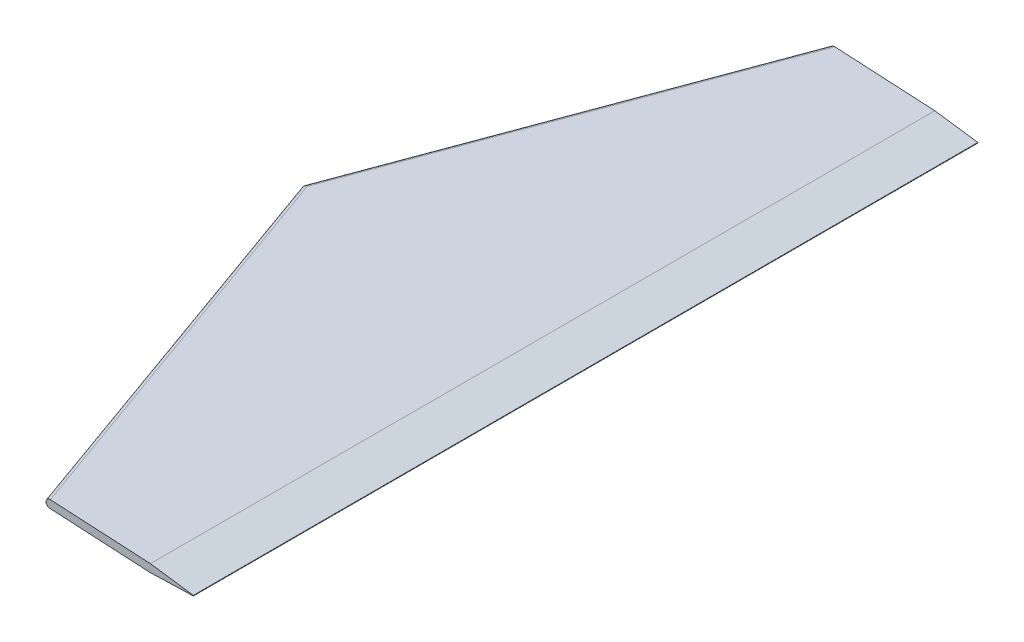
ISO-10303-21;
HEADER;
FILE_DESCRIPTION(('STEP AP214'),'2;1');
FILE_NAME('part.step','',(''),(''),'','','');
FILE_SCHEMA(('AUTOMOTIVE_DESIGN { 1 0 10303 214 1 1 1 1 }'));
ENDSEC;
DATA;
#1=APPLICATION_CONTEXT('core data for automotive mechanical design processes');
#2=APPLICATION_PROTOCOL_DEFINITION('international standard','automotive_design',2000,#1);
#3=PRODUCT_CONTEXT('',#1,'mechanical');
#4=PRODUCT('Part','Part','',(#3));
#5=PRODUCT_RELATED_PRODUCT_CATEGORY('part','',(#4));
#6=PRODUCT_DEFINITION_FORMATION('','',#4);
#7=PRODUCT_DEFINITION_CONTEXT('part definition',#1,'design');
#8=PRODUCT_DEFINITION('design','',#6,#7);
#9=PRODUCT_DEFINITION_SHAPE('','',#8);
#10=(LENGTH_UNIT() NAMED_UNIT(*) SI_UNIT(.MILLI.,.METRE.));
#11=(NAMED_UNIT(*) PLANE_ANGLE_UNIT() SI_UNIT($,.RADIAN.));
#12=(NAMED_UNIT(*) SI_UNIT($,.STERADIAN.) SOLID_ANGLE_UNIT());
#13=UNCERTAINTY_MEASURE_WITH_UNIT(LENGTH_MEASURE(1.E-05),#10,'distance_accuracy_value','');
#14=(GEOMETRIC_REPRESENTATION_CONTEXT(3) GLOBAL_UNCERTAINTY_ASSIGNED_CONTEXT((#13)) GLOBAL_UNIT_ASSIGNED_CONTEXT((#10,
#11,#12)) REPRESENTATION_CONTEXT('',''));
#15=CARTESIAN_POINT('',(0.,0.,0.));
#16=DIRECTION('',(0.,0.,1.));
#17=DIRECTION('',(1.,0.,0.));
#18=AXIS2_PLACEMENT_3D('',#15,#16,#17);
#19=CARTESIAN_POINT('',(0.,0.,275.6));
#20=DIRECTION('',(0.0539045346360019,0.998546093651002,0.));
#21=DIRECTION('',(-0.998546093651002,0.0539045346360019,0.));
#22=AXIS2_PLACEMENT_3D('',#19,#20,#21);
#23=PLANE('',#22);
#24=DIRECTION('',(-0.326634975757512,0.0176327427206422,-0.944986073440258));
#25=VECTOR('',#24,1.);
#26=CARTESIAN_POINT('',(87.6631460975016,-4.73232144731141,245.210881880629));
#27=LINE('',#26,#25);
#28=CARTESIAN_POINT('',(98.1671621239773,-5.29935996392712,275.6));
#29=VERTEX_POINT('',#28);
#30=CARTESIAN_POINT('',(2.90586478967181,-0.156867359652552,0.));
#31=VERTEX_POINT('',#30);
#32=EDGE_CURVE('E156',#29,#31,#27,.T.);
#33=ORIENTED_EDGE('',*,*,#32,.T.);
#34=DIRECTION('',(0.326634975757512,-0.0176327427206422,-0.944986073440258));
#35=VECTOR('',#34,1.);
#36=CARTESIAN_POINT('',(-82.4732792604655,4.45215675741676,247.009989981987));
#37=LINE('',#36,#35);
#38=CARTESIAN_POINT('',(98.1671621239773,-5.29935996392712,-275.6));
#39=VERTEX_POINT('',#38);
#40=EDGE_CURVE('E127',#31,#39,#37,.T.);
#41=ORIENTED_EDGE('',*,*,#40,.T.);
#42=DIRECTION('',(0.998546093651002,-0.0539045346360019,0.));
#43=VECTOR('',#42,1.);
#44=CARTESIAN_POINT('',(0.,0.,-275.6));
#45=LINE('',#44,#43);
#46=CARTESIAN_POINT('',(168.454725998924,-9.09369499309351,-275.6));
#47=VERTEX_POINT('',#46);
#48=EDGE_CURVE('E113',#39,#47,#45,.T.);
#49=ORIENTED_EDGE('',*,*,#48,.T.);
#50=DIRECTION('',(0.,0.,1.));
#51=VECTOR('',#50,1.);
#52=CARTESIAN_POINT('',(168.454725998924,-9.09369499309351,-275.6));
#53=LINE('',#52,#51);
#54=CARTESIAN_POINT('',(168.454725998924,-9.09369499309351,275.6));
#55=VERTEX_POINT('',#54);
#56=EDGE_CURVE('E119',#47,#55,#53,.T.);
#57=ORIENTED_EDGE('',*,*,#56,.T.);
#58=DIRECTION('',(0.998546093651002,-0.0539045346360019,0.));
#59=VECTOR('',#58,1.);
#60=CARTESIAN_POINT('',(0.,0.,275.6));
#61=LINE('',#60,#59);
#62=EDGE_CURVE('E150',#29,#55,#61,.T.);
#63=ORIENTED_EDGE('',*,*,#62,.F.);
#64=EDGE_LOOP('',(#33,#41,#49,#57,#63));
#65=FACE_BOUND('',#64,.T.);
#66=ADVANCED_FACE('F33',(#65),#23,.F.);
#67=CARTESIAN_POINT('',(0.296906614910487,5.5,275.6));
#68=DIRECTION('',(0.0539045346360018,0.998546093651002,0.));
#69=DIRECTION('',(-0.998546093651002,0.0539045346360019,0.));
#70=AXIS2_PLACEMENT_3D('',#67,#68,#69);
#71=PLANE('',#70);
#72=DIRECTION('',(0.998546093651002,-0.0539045346360018,0.));
#73=VECTOR('',#72,1.);
#74=CARTESIAN_POINT('',(0.296906614910487,5.5,-275.6));
#75=LINE('',#74,#73);
#76=CARTESIAN_POINT('',(98.4640687388878,0.200640036072879,-275.6));
#77=VERTEX_POINT('',#76);
#78=CARTESIAN_POINT('',(168.751632613834,-3.59369499309351,-275.6));
#79=VERTEX_POINT('',#78);
#80=EDGE_CURVE('E129',#77,#79,#75,.T.);
#81=ORIENTED_EDGE('',*,*,#80,.F.);
#82=DIRECTION('',(0.326634975757512,-0.0176327427206422,-0.944986073440258));
#83=VECTOR('',#82,1.);
#84=CARTESIAN_POINT('',(2.8918400334285,5.35991765505268,0.899554050678706));
#85=LINE('',#84,#83);
#86=CARTESIAN_POINT('',(3.20277140458229,5.34313264034745,0.));
#87=VERTEX_POINT('',#86);
#88=EDGE_CURVE('E170',#77,#87,#85,.F.);
#89=ORIENTED_EDGE('',*,*,#88,.T.);
#90=DIRECTION('',(-0.326634975757512,0.0176327427206422,-0.944986073440258));
#91=VECTOR('',#90,1.);
#92=CARTESIAN_POINT('',(98.153137367734,0.217425050778108,274.700445949321));
#93=LINE('',#92,#91);
#94=CARTESIAN_POINT('',(98.4640687388878,0.20064003607288,275.6));
#95=VERTEX_POINT('',#94);
#96=EDGE_CURVE('E168',#87,#95,#93,.F.);
#97=ORIENTED_EDGE('',*,*,#96,.T.);
#98=DIRECTION('',(0.998546093651002,-0.0539045346360018,0.));
#99=VECTOR('',#98,1.);
#100=CARTESIAN_POINT('',(0.296906614910487,5.5,275.6));
#101=LINE('',#100,#99);
#102=CARTESIAN_POINT('',(168.751632613834,-3.59369499309351,275.6));
#103=VERTEX_POINT('',#102);
#104=EDGE_CURVE('E128',#95,#103,#101,.T.);
#105=ORIENTED_EDGE('',*,*,#104,.T.);
#106=DIRECTION('',(0.,0.,1.));
#107=VECTOR('',#106,1.);
#108=CARTESIAN_POINT('',(168.751632613834,-3.59369499309351,-275.6));
#109=LINE('',#108,#107);
#110=EDGE_CURVE('E139',#79,#103,#109,.T.);
#111=ORIENTED_EDGE('',*,*,#110,.F.);
#112=EDGE_LOOP('',(#81,#89,#97,#105,#111));
#113=FACE_BOUND('',#112,.T.);
#114=ADVANCED_FACE('F212',(#113),#71,.T.);
#115=CARTESIAN_POINT('',(0.,0.,275.6));
#116=DIRECTION('',(0.,0.,-1.));
#117=DIRECTION('',(-1.,0.,0.));
#118=AXIS2_PLACEMENT_3D('',#115,#116,#117);
#119=PLANE('',#118);
#120=DIRECTION('',(-0.999547289474812,-0.0300868094612245,0.));
#121=VECTOR('',#120,1.);
#122=CARTESIAN_POINT('',(201.255636568767,-8.10637327569077,275.6));
#123=LINE('',#122,#121);
#124=CARTESIAN_POINT('',(198.881987466853,-8.17782114915217,275.6));
#125=VERTEX_POINT('',#124);
#126=EDGE_CURVE('E120',#125,#55,#123,.T.);
#127=ORIENTED_EDGE('',*,*,#126,.F.);
#128=CARTESIAN_POINT('',(198.875970104961,-7.9779116912572,275.6));
#129=DIRECTION('',(0.,0.,-1.));
#130=DIRECTION('',(-1.,0.,0.));
#131=AXIS2_PLACEMENT_3D('',#128,#129,#130);
#132=CIRCLE('',#131,0.2);
#133=CARTESIAN_POINT('',(198.903473215499,-7.77981176972574,275.6));
#134=VERTEX_POINT('',#133);
#135=EDGE_CURVE('E55',#125,#134,#132,.F.);
#136=ORIENTED_EDGE('',*,*,#135,.T.);
#137=DIRECTION('',(0.990499607657291,-0.13751555268679,0.));
#138=VECTOR('',#137,1.);
#139=CARTESIAN_POINT('',(168.751632613834,-3.59369499309351,275.6));
#140=LINE('',#139,#138);
#141=EDGE_CURVE('E133',#103,#134,#140,.T.);
#142=ORIENTED_EDGE('',*,*,#141,.F.);
#143=ORIENTED_EDGE('',*,*,#104,.F.);
#144=CARTESIAN_POINT('',(98.3158312686388,-2.54536172146738,275.6));
#145=DIRECTION('',(0.,0.,-1.));
#146=DIRECTION('',(0.998546093651002,-0.0539045346360019,0.));
#147=AXIS2_PLACEMENT_3D('',#144,#145,#146);
#148=ELLIPSE('',#147,2.91009579642642,2.75);
#149=CARTESIAN_POINT('',(95.409966478967,-2.38849436181483,275.6));
#150=VERTEX_POINT('',#149);
#151=EDGE_CURVE('E176',#95,#150,#148,.F.);
#152=ORIENTED_EDGE('',*,*,#151,.T.);
#153=DIRECTION('',(0.0539045346360019,0.998546093651002,0.));
#154=VECTOR('',#153,1.);
#155=CARTESIAN_POINT('',(94.6769404223068,-15.9673205285761,275.6));
#156=LINE('',#155,#154);
#157=CARTESIAN_POINT('',(95.4095348045545,-2.39649084673432,275.6));
#158=VERTEX_POINT('',#157);
#159=EDGE_CURVE('E143',#158,#150,#156,.T.);
#160=ORIENTED_EDGE('',*,*,#159,.F.);
#161=CARTESIAN_POINT('',(98.3153995942263,-2.55335820638687,275.6));
#162=DIRECTION('',(0.,0.,-1.));
#163=DIRECTION('',(-0.998546093651002,0.0539045346360019,0.));
#164=AXIS2_PLACEMENT_3D('',#161,#162,#163);
#165=ELLIPSE('',#164,2.91009579642642,2.75);
#166=EDGE_CURVE('E178',#158,#29,#165,.F.);
#167=ORIENTED_EDGE('',*,*,#166,.T.);
#168=ORIENTED_EDGE('',*,*,#62,.T.);
#169=EDGE_LOOP('',(#127,#136,#142,#143,#152,#160,#167,#168));
#170=FACE_BOUND('',#169,.T.);
#171=ADVANCED_FACE('F189',(#170),#119,.F.);
#172=CARTESIAN_POINT('',(0.,0.,-275.6));
#173=DIRECTION('',(0.,0.,-1.));
#174=DIRECTION('',(-1.,0.,0.));
#175=AXIS2_PLACEMENT_3D('',#172,#173,#174);
#176=PLANE('',#175);
#177=DIRECTION('',(0.990499607657291,-0.13751555268679,0.));
#178=VECTOR('',#177,1.);
#179=CARTESIAN_POINT('',(168.751632613834,-3.59369499309351,-275.6));
#180=LINE('',#179,#178);
#181=CARTESIAN_POINT('',(198.903473215499,-7.77981176972574,-275.6));
#182=VERTEX_POINT('',#181);
#183=EDGE_CURVE('E135',#79,#182,#180,.T.);
#184=ORIENTED_EDGE('',*,*,#183,.T.);
#185=CARTESIAN_POINT('',(198.875970104961,-7.9779116912572,-275.6));
#186=DIRECTION('',(0.,0.,-1.));
#187=DIRECTION('',(-1.,0.,0.));
#188=AXIS2_PLACEMENT_3D('',#185,#186,#187);
#189=CIRCLE('',#188,0.2);
#190=CARTESIAN_POINT('',(198.881987466853,-8.17782114915217,-275.6));
#191=VERTEX_POINT('',#190);
#192=EDGE_CURVE('E11',#182,#191,#189,.T.);
#193=ORIENTED_EDGE('',*,*,#192,.T.);
#194=DIRECTION('',(-0.999547289474812,-0.0300868094612245,0.));
#195=VECTOR('',#194,1.);
#196=CARTESIAN_POINT('',(201.255636568767,-8.10637327569077,-275.6));
#197=LINE('',#196,#195);
#198=EDGE_CURVE('E110',#191,#47,#197,.T.);
#199=ORIENTED_EDGE('',*,*,#198,.T.);
#200=ORIENTED_EDGE('',*,*,#48,.F.);
#201=CARTESIAN_POINT('',(98.3153995942263,-2.55335820638687,-275.6));
#202=DIRECTION('',(0.,0.,-1.));
#203=DIRECTION('',(0.998546093651002,-0.0539045346360019,0.));
#204=AXIS2_PLACEMENT_3D('',#201,#202,#203);
#205=ELLIPSE('',#204,2.91009579642642,2.75);
#206=CARTESIAN_POINT('',(95.4095348045545,-2.39649084673432,-275.6));
#207=VERTEX_POINT('',#206);
#208=EDGE_CURVE('E161',#39,#207,#205,.T.);
#209=ORIENTED_EDGE('',*,*,#208,.T.);
#210=DIRECTION('',(-0.0539045346360019,-0.998546093651002,0.));
#211=VECTOR('',#210,1.);
#212=CARTESIAN_POINT('',(95.2612973343055,-5.14249260427457,-275.6));
#213=LINE('',#212,#211);
#214=CARTESIAN_POINT('',(95.409966478967,-2.38849436181483,-275.6));
#215=VERTEX_POINT('',#214);
#216=EDGE_CURVE('E152',#215,#207,#213,.T.);
#217=ORIENTED_EDGE('',*,*,#216,.F.);
#218=CARTESIAN_POINT('',(98.3158312686388,-2.54536172146738,-275.6));
#219=DIRECTION('',(0.,0.,-1.));
#220=DIRECTION('',(-0.998546093651002,0.0539045346360019,0.));
#221=AXIS2_PLACEMENT_3D('',#218,#219,#220);
#222=ELLIPSE('',#221,2.91009579642642,2.75);
#223=EDGE_CURVE('E159',#215,#77,#222,.T.);
#224=ORIENTED_EDGE('',*,*,#223,.T.);
#225=ORIENTED_EDGE('',*,*,#80,.T.);
#226=EDGE_LOOP('',(#184,#193,#199,#200,#209,#217,#224,#225));
#227=FACE_BOUND('',#226,.T.);
#228=ADVANCED_FACE('F112',(#227),#176,.T.);
#229=CARTESIAN_POINT('',(-0.584356911998705,-10.8248279243015,0.));
#230=DIRECTION('',(0.943612152188369,-0.0509390345262998,0.327110563883166));
#231=DIRECTION('',(0.32753578240665,0.,-0.94483877526447));
#232=AXIS2_PLACEMENT_3D('',#229,#230,#231);
#233=PLANE('',#232);
#234=ORIENTED_EDGE('',*,*,#216,.T.);
#235=DIRECTION('',(0.326634975757512,-0.0176327427206422,-0.944986073440258));
#236=VECTOR('',#235,1.);
#237=CARTESIAN_POINT('',(0.148237470249005,2.74600175754026,0.));
#238=LINE('',#237,#236);
#239=CARTESIAN_POINT('',(0.148237470249005,2.74600175754025,0.));
#240=VERTEX_POINT('',#239);
#241=EDGE_CURVE('E166',#207,#240,#238,.F.);
#242=ORIENTED_EDGE('',*,*,#241,.T.);
#243=DIRECTION('',(0.0539045346360019,0.998546093651002,0.));
#244=VECTOR('',#243,1.);
#245=CARTESIAN_POINT('',(-0.584356911998705,-10.8248279243015,0.));
#246=LINE('',#245,#244);
#247=CARTESIAN_POINT('',(0.148669144661483,2.75399824245974,0.));
#248=VERTEX_POINT('',#247);
#249=EDGE_CURVE('E146',#240,#248,#246,.T.);
#250=ORIENTED_EDGE('',*,*,#249,.T.);
#251=DIRECTION('',(0.326634975757512,-0.0176327427206422,-0.944986073440258));
#252=VECTOR('',#251,1.);
#253=CARTESIAN_POINT('',(95.409966478967,-2.38849436181483,-275.6));
#254=LINE('',#253,#252);
#255=EDGE_CURVE('E163',#248,#215,#254,.T.);
#256=ORIENTED_EDGE('',*,*,#255,.T.);
#257=EDGE_LOOP('',(#234,#242,#250,#256));
#258=FACE_BOUND('',#257,.T.);
#259=ADVANCED_FACE('F202',(#258),#233,.F.);
#260=CARTESIAN_POINT('',(-0.584356911998705,-10.8248279243015,0.));
#261=DIRECTION('',(0.943612152188369,-0.0509390345262998,-0.327110563883166));
#262=DIRECTION('',(-0.32753578240665,0.,-0.94483877526447));
#263=AXIS2_PLACEMENT_3D('',#260,#261,#262);
#264=PLANE('',#263);
#265=ORIENTED_EDGE('',*,*,#249,.F.);
#266=DIRECTION('',(-0.326634975757512,0.0176327427206422,-0.944986073440258));
#267=VECTOR('',#266,1.);
#268=CARTESIAN_POINT('',(0.148237470249005,2.74600175754025,0.));
#269=LINE('',#268,#267);
#270=EDGE_CURVE('E174',#240,#158,#269,.F.);
#271=ORIENTED_EDGE('',*,*,#270,.T.);
#272=ORIENTED_EDGE('',*,*,#159,.T.);
#273=DIRECTION('',(-0.326634975757512,0.0176327427206422,-0.944986073440258));
#274=VECTOR('',#273,1.);
#275=CARTESIAN_POINT('',(0.148669144661483,2.75399824245974,0.));
#276=LINE('',#275,#274);
#277=EDGE_CURVE('E172',#150,#248,#276,.T.);
#278=ORIENTED_EDGE('',*,*,#277,.T.);
#279=EDGE_LOOP('',(#265,#271,#272,#278));
#280=FACE_BOUND('',#279,.T.);
#281=ADVANCED_FACE('F221',(#280),#264,.F.);
#282=CARTESIAN_POINT('',(168.751632613834,-3.59369499309351,-275.6));
#283=DIRECTION('',(-0.13751555268679,-0.990499607657291,0.));
#284=DIRECTION('',(0.990499607657291,-0.13751555268679,0.));
#285=AXIS2_PLACEMENT_3D('',#282,#283,#284);
#286=PLANE('',#285);
#287=ORIENTED_EDGE('',*,*,#141,.T.);
#288=DIRECTION('',(0.,0.,1.));
#289=VECTOR('',#288,1.);
#290=CARTESIAN_POINT('',(198.903473215499,-7.77981176972574,-275.6));
#291=LINE('',#290,#289);
#292=EDGE_CURVE('E41',#134,#182,#291,.F.);
#293=ORIENTED_EDGE('',*,*,#292,.T.);
#294=ORIENTED_EDGE('',*,*,#183,.F.);
#295=ORIENTED_EDGE('',*,*,#110,.T.);
#296=EDGE_LOOP('',(#287,#293,#294,#295));
#297=FACE_BOUND('',#296,.T.);
#298=ADVANCED_FACE('F215',(#297),#286,.F.);
#299=CARTESIAN_POINT('',(201.255636568767,-8.10637327569077,-275.6));
#300=DIRECTION('',(-0.0300868094612245,0.999547289474812,0.));
#301=DIRECTION('',(-0.999547289474812,-0.0300868094612245,0.));
#302=AXIS2_PLACEMENT_3D('',#299,#300,#301);
#303=PLANE('',#302);
#304=ORIENTED_EDGE('',*,*,#198,.F.);
#305=DIRECTION('',(0.,0.,1.));
#306=VECTOR('',#305,1.);
#307=CARTESIAN_POINT('',(198.881987466853,-8.17782114915217,-275.6));
#308=LINE('',#307,#306);
#309=EDGE_CURVE('E180',#191,#125,#308,.T.);
#310=ORIENTED_EDGE('',*,*,#309,.T.);
#311=ORIENTED_EDGE('',*,*,#126,.T.);
#312=ORIENTED_EDGE('',*,*,#56,.F.);
#313=EDGE_LOOP('',(#304,#310,#311,#312));
#314=FACE_BOUND('',#313,.T.);
#315=ADVANCED_FACE('F131',(#314),#303,.F.);
#316=CARTESIAN_POINT('',(87.8113835677506,-1.98631968977115,245.210881880629));
#317=DIRECTION('',(-0.326634975757512,0.0176327427206422,-0.944986073440258));
#318=DIRECTION('',(-0.945133012223609,0.,0.326685765231861));
#319=AXIS2_PLACEMENT_3D('',#316,#317,#318);
#320=CYLINDRICAL_SURFACE('',#319,2.75);
#321=ORIENTED_EDGE('',*,*,#166,.F.);
#322=ORIENTED_EDGE('',*,*,#270,.F.);
#323=CARTESIAN_POINT('',(3.05410225992082,2.5891343978877,0.));
#324=DIRECTION('',(0.,0.,-1.));
#325=DIRECTION('',(-0.998546093651002,0.0539045346360019,0.));
#326=AXIS2_PLACEMENT_3D('',#323,#324,#325);
#327=ELLIPSE('',#326,2.91009579642642,2.75);
#328=EDGE_CURVE('E181',#31,#240,#327,.T.);
#329=ORIENTED_EDGE('',*,*,#328,.F.);
#330=ORIENTED_EDGE('',*,*,#32,.F.);
#331=EDGE_LOOP('',(#321,#322,#329,#330));
#332=FACE_BOUND('',#331,.T.);
#333=ADVANCED_FACE('F195',(#332),#320,.T.);
#334=CARTESIAN_POINT('',(-82.3250417902165,7.19815851495702,247.009989981987));
#335=DIRECTION('',(0.326634975757512,-0.0176327427206422,-0.944986073440258));
#336=DIRECTION('',(-0.945133012223609,0.,-0.326685765231861));
#337=AXIS2_PLACEMENT_3D('',#334,#335,#336);
#338=CYLINDRICAL_SURFACE('',#337,2.75);
#339=ORIENTED_EDGE('',*,*,#328,.T.);
#340=ORIENTED_EDGE('',*,*,#241,.F.);
#341=ORIENTED_EDGE('',*,*,#208,.F.);
#342=ORIENTED_EDGE('',*,*,#40,.F.);
#343=EDGE_LOOP('',(#339,#340,#341,#342));
#344=FACE_BOUND('',#343,.T.);
#345=ADVANCED_FACE('F199',(#344),#338,.T.);
#346=CARTESIAN_POINT('',(2.7436025631795,2.61391589751242,-0.899554050678707));
#347=DIRECTION('',(0.326634975757512,-0.0176327427206422,0.944986073440258));
#348=DIRECTION('',(0.945133012223609,0.,-0.326685765231861));
#349=AXIS2_PLACEMENT_3D('',#346,#347,#348);
#350=CYLINDRICAL_SURFACE('',#349,2.75);
#351=ORIENTED_EDGE('',*,*,#151,.F.);
#352=ORIENTED_EDGE('',*,*,#96,.F.);
#353=CARTESIAN_POINT('',(3.05453393433328,2.59713088280719,0.));
#354=DIRECTION('',(0.,0.,1.));
#355=DIRECTION('',(0.998546093651002,-0.0539045346360018,0.));
#356=AXIS2_PLACEMENT_3D('',#353,#354,#355);
#357=ELLIPSE('',#356,2.91009579642642,2.75);
#358=EDGE_CURVE('E184',#248,#87,#357,.F.);
#359=ORIENTED_EDGE('',*,*,#358,.F.);
#360=ORIENTED_EDGE('',*,*,#277,.F.);
#361=EDGE_LOOP('',(#351,#352,#359,#360));
#362=FACE_BOUND('',#361,.T.);
#363=ADVANCED_FACE('F219',(#362),#350,.T.);
#364=CARTESIAN_POINT('',(2.7436025631795,2.61391589751242,0.899554050678706));
#365=DIRECTION('',(-0.326634975757512,0.0176327427206422,0.944986073440258));
#366=DIRECTION('',(0.945133012223609,0.,0.326685765231861));
#367=AXIS2_PLACEMENT_3D('',#364,#365,#366);
#368=CYLINDRICAL_SURFACE('',#367,2.75);
#369=ORIENTED_EDGE('',*,*,#358,.T.);
#370=ORIENTED_EDGE('',*,*,#88,.F.);
#371=ORIENTED_EDGE('',*,*,#223,.F.);
#372=ORIENTED_EDGE('',*,*,#255,.F.);
#373=EDGE_LOOP('',(#369,#370,#371,#372));
#374=FACE_BOUND('',#373,.T.);
#375=ADVANCED_FACE('F207',(#374),#368,.T.);
#376=CARTESIAN_POINT('',(198.875970104961,-7.9779116912572,-275.6));
#377=DIRECTION('',(0.,0.,1.));
#378=DIRECTION('',(1.,0.,0.));
#379=AXIS2_PLACEMENT_3D('',#376,#377,#378);
#380=CYLINDRICAL_SURFACE('',#379,0.2);
#381=ORIENTED_EDGE('',*,*,#192,.F.);
#382=ORIENTED_EDGE('',*,*,#292,.F.);
#383=ORIENTED_EDGE('',*,*,#135,.F.);
#384=ORIENTED_EDGE('',*,*,#309,.F.);
#385=EDGE_LOOP('',(#381,#382,#383,#384));
#386=FACE_BOUND('',#385,.T.);
#387=ADVANCED_FACE('F35',(#386),#380,.T.);
#388=CLOSED_SHELL('',(#66,#114,#171,#228,#259,#281,#298,#315,#333,#345,#363,#375,#387));
#389=MANIFOLD_SOLID_BREP('B2',#388);
#390=ADVANCED_BREP_SHAPE_REPRESENTATION('',(#18,#389),#14);
#391=SHAPE_DEFINITION_REPRESENTATION(#9,#390);
ENDSEC;
END-ISO-10303-21;
